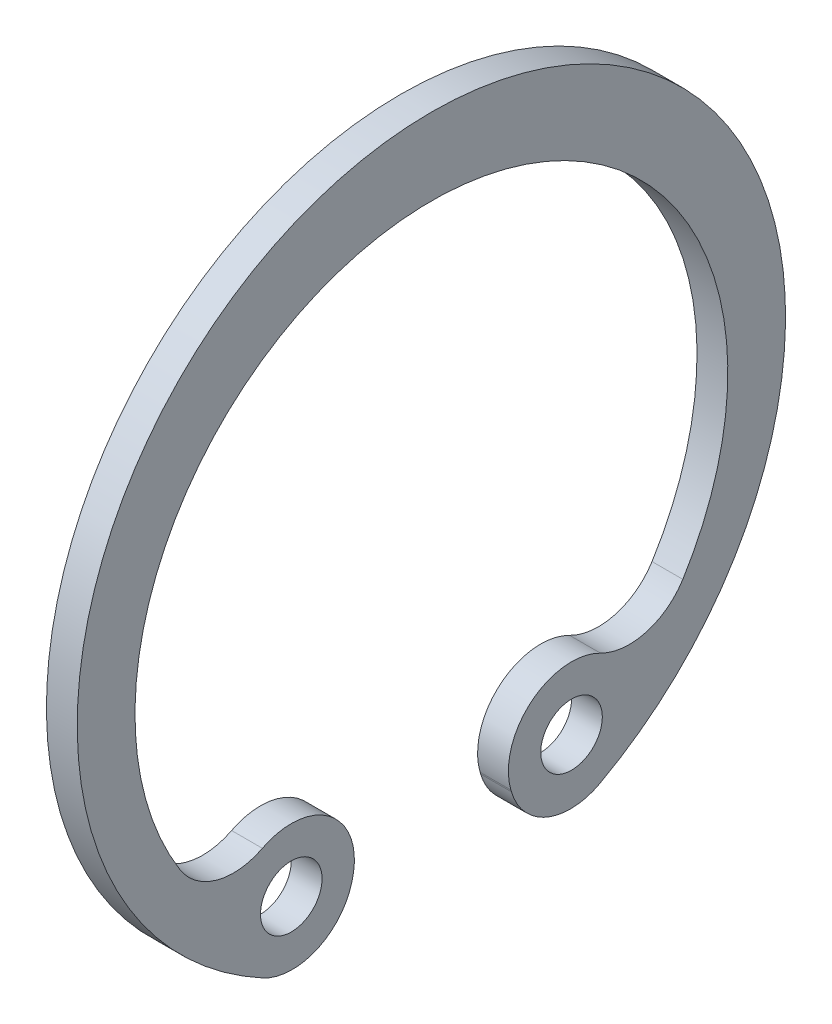
ISO-10303-21;
HEADER;
FILE_DESCRIPTION(('STEP AP214'),'2;1');
FILE_NAME('part.step','',(''),(''),'','','');
FILE_SCHEMA(('AUTOMOTIVE_DESIGN { 1 0 10303 214 1 1 1 1 }'));
ENDSEC;
DATA;
#1=APPLICATION_CONTEXT('core data for automotive mechanical design processes');
#2=APPLICATION_PROTOCOL_DEFINITION('international standard','automotive_design',2000,#1);
#3=PRODUCT_CONTEXT('',#1,'mechanical');
#4=PRODUCT('Part','Part','',(#3));
#5=PRODUCT_RELATED_PRODUCT_CATEGORY('part','',(#4));
#6=PRODUCT_DEFINITION_FORMATION('','',#4);
#7=PRODUCT_DEFINITION_CONTEXT('part definition',#1,'design');
#8=PRODUCT_DEFINITION('design','',#6,#7);
#9=PRODUCT_DEFINITION_SHAPE('','',#8);
#10=(LENGTH_UNIT() NAMED_UNIT(*) SI_UNIT(.MILLI.,.METRE.));
#11=(NAMED_UNIT(*) PLANE_ANGLE_UNIT() SI_UNIT($,.RADIAN.));
#12=(NAMED_UNIT(*) SI_UNIT($,.STERADIAN.) SOLID_ANGLE_UNIT());
#13=UNCERTAINTY_MEASURE_WITH_UNIT(LENGTH_MEASURE(1.E-05),#10,'distance_accuracy_value','');
#14=(GEOMETRIC_REPRESENTATION_CONTEXT(3) GLOBAL_UNCERTAINTY_ASSIGNED_CONTEXT((#13)) GLOBAL_UNIT_ASSIGNED_CONTEXT((#10,
#11,#12)) REPRESENTATION_CONTEXT('',''));
#15=CARTESIAN_POINT('',(0.,0.,0.));
#16=DIRECTION('',(0.,0.,1.));
#17=DIRECTION('',(1.,0.,0.));
#18=AXIS2_PLACEMENT_3D('',#15,#16,#17);
#19=CARTESIAN_POINT('',(0.5,-8.35614485396469,-4.51938526567201));
#20=DIRECTION('',(-1.,0.,0.));
#21=DIRECTION('',(0.,-0.879594195153662,-0.475724764808373));
#22=AXIS2_PLACEMENT_3D('',#19,#20,#21);
#23=CYLINDRICAL_SURFACE('',#22,1.99999999999884);
#24=CARTESIAN_POINT('',(-0.5,-8.35614485396469,-4.51938526567201));
#25=DIRECTION('',(1.,0.,0.));
#26=DIRECTION('',(0.,-0.279885186746017,0.960033479749611));
#27=AXIS2_PLACEMENT_3D('',#24,#25,#26);
#28=CIRCLE('',#27,1.99999999999884);
#29=CARTESIAN_POINT('',(-0.5,-8.9159152274564,-2.5993183061739));
#30=VERTEX_POINT('',#29);
#31=CARTESIAN_POINT('',(-0.5,-10.115333244271,-5.4708347952882));
#32=VERTEX_POINT('',#31);
#33=EDGE_CURVE('E95',#30,#32,#28,.T.);
#34=ORIENTED_EDGE('',*,*,#33,.T.);
#35=DIRECTION('',(1.,0.,0.));
#36=VECTOR('',#35,1.);
#37=CARTESIAN_POINT('',(-0.5,-10.115333244271,-5.4708347952882));
#38=LINE('',#37,#36);
#39=CARTESIAN_POINT('',(0.5,-10.115333244271,-5.4708347952882));
#40=VERTEX_POINT('',#39);
#41=EDGE_CURVE('E109',#40,#32,#38,.F.);
#42=ORIENTED_EDGE('',*,*,#41,.F.);
#43=CARTESIAN_POINT('',(0.5,-8.35614485396469,-4.51938526567201));
#44=DIRECTION('',(-1.,0.,0.));
#45=DIRECTION('',(0.,-0.879594195153662,-0.475724764808373));
#46=AXIS2_PLACEMENT_3D('',#43,#44,#45);
#47=CIRCLE('',#46,1.99999999999884);
#48=CARTESIAN_POINT('',(0.5,-8.9159152274564,-2.5993183061739));
#49=VERTEX_POINT('',#48);
#50=EDGE_CURVE('E115',#49,#40,#47,.F.);
#51=ORIENTED_EDGE('',*,*,#50,.F.);
#52=DIRECTION('',(-1.,0.,0.));
#53=VECTOR('',#52,1.);
#54=CARTESIAN_POINT('',(0.5,-8.9159152274564,-2.5993183061739));
#55=LINE('',#54,#53);
#56=EDGE_CURVE('E103',#49,#30,#55,.T.);
#57=ORIENTED_EDGE('',*,*,#56,.T.);
#58=EDGE_LOOP('',(#34,#42,#51,#57));
#59=FACE_BOUND('',#58,.T.);
#60=ADVANCED_FACE('F16',(#59),#23,.T.);
#61=CARTESIAN_POINT('',(0.5,2.27682456221956E-13,0.));
#62=DIRECTION('',(-1.,0.,0.));
#63=DIRECTION('',(0.,1.,0.));
#64=AXIS2_PLACEMENT_3D('',#61,#62,#63);
#65=CYLINDRICAL_SURFACE('',#64,11.4999999999998);
#66=ORIENTED_EDGE('',*,*,#41,.T.);
#67=CARTESIAN_POINT('',(-0.5,2.27682456221956E-13,0.));
#68=DIRECTION('',(1.,0.,0.));
#69=DIRECTION('',(0.,-0.879594195154038,-0.475724764807678));
#70=AXIS2_PLACEMENT_3D('',#67,#68,#69);
#71=CIRCLE('',#70,11.4999999999998);
#72=CARTESIAN_POINT('',(-0.5,-10.115333244271,5.4708347952882));
#73=VERTEX_POINT('',#72);
#74=EDGE_CURVE('E91',#32,#73,#71,.T.);
#75=ORIENTED_EDGE('',*,*,#74,.T.);
#76=DIRECTION('',(1.,0.,0.));
#77=VECTOR('',#76,1.);
#78=CARTESIAN_POINT('',(-0.5,-10.115333244271,5.4708347952882));
#79=LINE('',#78,#77);
#80=CARTESIAN_POINT('',(0.5,-10.115333244271,5.4708347952882));
#81=VERTEX_POINT('',#80);
#82=EDGE_CURVE('E102',#81,#73,#79,.F.);
#83=ORIENTED_EDGE('',*,*,#82,.F.);
#84=CARTESIAN_POINT('',(0.5,2.27682456221956E-13,0.));
#85=DIRECTION('',(-1.,0.,0.));
#86=DIRECTION('',(0.,-0.879594195154037,0.47572476480768));
#87=AXIS2_PLACEMENT_3D('',#84,#85,#86);
#88=CIRCLE('',#87,11.4999999999998);
#89=EDGE_CURVE('E114',#40,#81,#88,.F.);
#90=ORIENTED_EDGE('',*,*,#89,.F.);
#91=EDGE_LOOP('',(#66,#75,#83,#90));
#92=FACE_BOUND('',#91,.T.);
#93=ADVANCED_FACE('F113',(#92),#65,.T.);
#94=CARTESIAN_POINT('',(0.5,-8.3561448539647,4.51938526567201));
#95=DIRECTION('',(-1.,0.,0.));
#96=DIRECTION('',(0.,-0.279885186746011,-0.960033479749613));
#97=AXIS2_PLACEMENT_3D('',#94,#95,#96);
#98=CYLINDRICAL_SURFACE('',#97,1.99999999999884);
#99=CARTESIAN_POINT('',(-0.5,-8.3561448539647,4.51938526567201));
#100=DIRECTION('',(1.,0.,0.));
#101=DIRECTION('',(0.,-0.87959419515366,0.475724764808376));
#102=AXIS2_PLACEMENT_3D('',#99,#100,#101);
#103=CIRCLE('',#102,1.99999999999884);
#104=CARTESIAN_POINT('',(-0.5,-8.9159152274564,2.5993183061739));
#105=VERTEX_POINT('',#104);
#106=EDGE_CURVE('E97',#73,#105,#103,.T.);
#107=ORIENTED_EDGE('',*,*,#106,.T.);
#108=DIRECTION('',(1.,0.,0.));
#109=VECTOR('',#108,1.);
#110=CARTESIAN_POINT('',(-0.5,-8.9159152274564,2.5993183061739));
#111=LINE('',#110,#109);
#112=CARTESIAN_POINT('',(0.5,-8.9159152274564,2.5993183061739));
#113=VERTEX_POINT('',#112);
#114=EDGE_CURVE('E137',#113,#105,#111,.F.);
#115=ORIENTED_EDGE('',*,*,#114,.F.);
#116=CARTESIAN_POINT('',(0.5,-8.3561448539647,4.51938526567201));
#117=DIRECTION('',(-1.,0.,0.));
#118=DIRECTION('',(0.,-0.279885186746011,-0.960033479749613));
#119=AXIS2_PLACEMENT_3D('',#116,#117,#118);
#120=CIRCLE('',#119,1.99999999999884);
#121=EDGE_CURVE('E142',#81,#113,#120,.F.);
#122=ORIENTED_EDGE('',*,*,#121,.F.);
#123=ORIENTED_EDGE('',*,*,#82,.T.);
#124=EDGE_LOOP('',(#107,#115,#122,#123));
#125=FACE_BOUND('',#124,.T.);
#126=ADVANCED_FACE('F262',(#125),#98,.T.);
#127=CARTESIAN_POINT('',(-0.5,-8.8562763291698,2.5819313665136));
#128=DIRECTION('',(0.,-0.279885186746055,-0.9600334797496));
#129=DIRECTION('',(1.,0.,0.));
#130=AXIS2_PLACEMENT_3D('',#127,#128,#129);
#131=PLANE('',#130);
#132=DIRECTION('',(0.,0.9600334797496,-0.279885186746055));
#133=VECTOR('',#132,1.);
#134=CARTESIAN_POINT('',(-0.5,-8.9159152274564,2.5993183061739));
#135=LINE('',#134,#133);
#136=CARTESIAN_POINT('',(-0.5,-8.8562763291698,2.5819313665136));
#137=VERTEX_POINT('',#136);
#138=EDGE_CURVE('E146',#105,#137,#135,.T.);
#139=ORIENTED_EDGE('',*,*,#138,.T.);
#140=DIRECTION('',(1.,0.,0.));
#141=VECTOR('',#140,1.);
#142=CARTESIAN_POINT('',(-0.5,-8.8562763291698,2.5819313665136));
#143=LINE('',#142,#141);
#144=CARTESIAN_POINT('',(0.5,-8.8562763291698,2.5819313665136));
#145=VERTEX_POINT('',#144);
#146=EDGE_CURVE('E151',#145,#137,#143,.F.);
#147=ORIENTED_EDGE('',*,*,#146,.F.);
#148=DIRECTION('',(0.,-0.9600334797496,0.279885186746055));
#149=VECTOR('',#148,1.);
#150=CARTESIAN_POINT('',(0.5,-8.8562763291698,2.5819313665136));
#151=LINE('',#150,#149);
#152=EDGE_CURVE('E156',#113,#145,#151,.F.);
#153=ORIENTED_EDGE('',*,*,#152,.F.);
#154=ORIENTED_EDGE('',*,*,#114,.T.);
#155=EDGE_LOOP('',(#139,#147,#153,#154));
#156=FACE_BOUND('',#155,.T.);
#157=ADVANCED_FACE('F267',(#156),#131,.T.);
#158=CARTESIAN_POINT('',(0.5,-8.28251169633942,4.55));
#159=DIRECTION('',(-1.,0.,0.));
#160=DIRECTION('',(0.,0.889237660823935,0.457445496832548));
#161=AXIS2_PLACEMENT_3D('',#158,#159,#160);
#162=CYLINDRICAL_SURFACE('',#161,2.04999999999997);
#163=CARTESIAN_POINT('',(-0.5,-8.28251169633942,4.55));
#164=DIRECTION('',(1.,0.,0.));
#165=DIRECTION('',(0.,-0.279885186746527,-0.960033479749463));
#166=AXIS2_PLACEMENT_3D('',#163,#164,#165);
#167=CIRCLE('',#166,2.04999999999997);
#168=CARTESIAN_POINT('',(-0.5,-6.45957449165038,5.48776326850671));
#169=VERTEX_POINT('',#168);
#170=EDGE_CURVE('E160',#137,#169,#167,.T.);
#171=ORIENTED_EDGE('',*,*,#170,.T.);
#172=DIRECTION('',(1.,0.,0.));
#173=VECTOR('',#172,1.);
#174=CARTESIAN_POINT('',(-0.5,-6.45957449165038,5.48776326850671));
#175=LINE('',#174,#173);
#176=CARTESIAN_POINT('',(0.5,-6.45957449165038,5.48776326850671));
#177=VERTEX_POINT('',#176);
#178=EDGE_CURVE('E165',#177,#169,#175,.F.);
#179=ORIENTED_EDGE('',*,*,#178,.F.);
#180=CARTESIAN_POINT('',(0.5,-8.28251169633942,4.55));
#181=DIRECTION('',(-1.,0.,0.));
#182=DIRECTION('',(0.,0.889237660823935,0.457445496832547));
#183=AXIS2_PLACEMENT_3D('',#180,#181,#182);
#184=CIRCLE('',#183,2.04999999999997);
#185=EDGE_CURVE('E170',#145,#177,#184,.F.);
#186=ORIENTED_EDGE('',*,*,#185,.F.);
#187=ORIENTED_EDGE('',*,*,#146,.T.);
#188=EDGE_LOOP('',(#171,#179,#186,#187));
#189=FACE_BOUND('',#188,.T.);
#190=ADVANCED_FACE('F271',(#189),#162,.T.);
#191=CARTESIAN_POINT('',(0.5,-4.63663728696139,6.42552653701331));
#192=DIRECTION('',(-1.,0.,0.));
#193=DIRECTION('',(0.,-0.889237660823951,-0.457445496832516));
#194=AXIS2_PLACEMENT_3D('',#191,#192,#193);
#195=CYLINDRICAL_SURFACE('',#194,2.0499999999999);
#196=CARTESIAN_POINT('',(-0.5,-4.63663728696139,6.42552653701331));
#197=DIRECTION('',(-1.,0.,0.));
#198=DIRECTION('',(0.,-0.889237660823951,-0.457445496832516));
#199=AXIS2_PLACEMENT_3D('',#196,#197,#198);
#200=CIRCLE('',#199,2.0499999999999);
#201=CARTESIAN_POINT('',(-0.5,-5.7222949025745,8.1644479100664));
#202=VERTEX_POINT('',#201);
#203=EDGE_CURVE('E174',#202,#169,#200,.F.);
#204=ORIENTED_EDGE('',*,*,#203,.F.);
#205=DIRECTION('',(1.,0.,0.));
#206=VECTOR('',#205,1.);
#207=CARTESIAN_POINT('',(-0.5,-5.7222949025745,8.1644479100664));
#208=LINE('',#207,#206);
#209=CARTESIAN_POINT('',(0.5,-5.7222949025745,8.1644479100664));
#210=VERTEX_POINT('',#209);
#211=EDGE_CURVE('E178',#210,#202,#208,.F.);
#212=ORIENTED_EDGE('',*,*,#211,.F.);
#213=CARTESIAN_POINT('',(0.5,-4.63663728696139,6.42552653701331));
#214=DIRECTION('',(1.,0.,0.));
#215=DIRECTION('',(0.,-0.529589080786909,0.848254328318622));
#216=AXIS2_PLACEMENT_3D('',#213,#214,#215);
#217=CIRCLE('',#216,2.0499999999999);
#218=EDGE_CURVE('E183',#210,#177,#217,.T.);
#219=ORIENTED_EDGE('',*,*,#218,.T.);
#220=ORIENTED_EDGE('',*,*,#178,.T.);
#221=EDGE_LOOP('',(#204,#212,#219,#220));
#222=FACE_BOUND('',#221,.T.);
#223=ADVANCED_FACE('F275',(#222),#195,.F.);
#224=CARTESIAN_POINT('',(0.5,-0.624999999999986,0.));
#225=DIRECTION('',(-1.,0.,0.));
#226=DIRECTION('',(0.,-0.529589080786963,0.848254328318588));
#227=AXIS2_PLACEMENT_3D('',#224,#225,#226);
#228=CYLINDRICAL_SURFACE('',#227,9.625);
#229=ORIENTED_EDGE('',*,*,#211,.T.);
#230=CARTESIAN_POINT('',(-0.5,-0.624999999999986,0.));
#231=DIRECTION('',(-1.,0.,0.));
#232=DIRECTION('',(0.,-0.529589080786963,0.848254328318588));
#233=AXIS2_PLACEMENT_3D('',#230,#231,#232);
#234=CIRCLE('',#233,9.625);
#235=CARTESIAN_POINT('',(-0.5,-5.7222949025745,-8.16444791006641));
#236=VERTEX_POINT('',#235);
#237=EDGE_CURVE('E188',#236,#202,#234,.F.);
#238=ORIENTED_EDGE('',*,*,#237,.F.);
#239=DIRECTION('',(1.,0.,0.));
#240=VECTOR('',#239,1.);
#241=CARTESIAN_POINT('',(-0.5,-5.72229490257452,-8.16444791006641));
#242=LINE('',#241,#240);
#243=CARTESIAN_POINT('',(0.5,-5.72229490257451,-8.16444791006641));
#244=VERTEX_POINT('',#243);
#245=EDGE_CURVE('E192',#244,#236,#242,.F.);
#246=ORIENTED_EDGE('',*,*,#245,.F.);
#247=CARTESIAN_POINT('',(0.5,-0.624999999999986,0.));
#248=DIRECTION('',(1.,0.,0.));
#249=DIRECTION('',(0.,-0.529589080786963,-0.848254328318588));
#250=AXIS2_PLACEMENT_3D('',#247,#248,#249);
#251=CIRCLE('',#250,9.625);
#252=EDGE_CURVE('E197',#244,#210,#251,.T.);
#253=ORIENTED_EDGE('',*,*,#252,.T.);
#254=EDGE_LOOP('',(#229,#238,#246,#253));
#255=FACE_BOUND('',#254,.T.);
#256=ADVANCED_FACE('F279',(#255),#228,.F.);
#257=CARTESIAN_POINT('',(0.5,-4.63663728696139,-6.42552653701331));
#258=DIRECTION('',(-1.,0.,0.));
#259=DIRECTION('',(0.,-0.529589080786909,-0.848254328318622));
#260=AXIS2_PLACEMENT_3D('',#257,#258,#259);
#261=CYLINDRICAL_SURFACE('',#260,2.0499999999999);
#262=CARTESIAN_POINT('',(-0.5,-4.63663728696139,-6.42552653701331));
#263=DIRECTION('',(-1.,0.,0.));
#264=DIRECTION('',(0.,-0.529589080786912,-0.84825432831862));
#265=AXIS2_PLACEMENT_3D('',#262,#263,#264);
#266=CIRCLE('',#265,2.0499999999999);
#267=CARTESIAN_POINT('',(-0.5,-6.4595744916504,-5.4877632685067));
#268=VERTEX_POINT('',#267);
#269=EDGE_CURVE('E202',#268,#236,#266,.F.);
#270=ORIENTED_EDGE('',*,*,#269,.F.);
#271=DIRECTION('',(1.,0.,0.));
#272=VECTOR('',#271,1.);
#273=CARTESIAN_POINT('',(-0.5,-6.4595744916504,-5.4877632685067));
#274=LINE('',#273,#272);
#275=CARTESIAN_POINT('',(0.5,-6.4595744916504,-5.4877632685067));
#276=VERTEX_POINT('',#275);
#277=EDGE_CURVE('E206',#276,#268,#274,.F.);
#278=ORIENTED_EDGE('',*,*,#277,.F.);
#279=CARTESIAN_POINT('',(0.5,-4.63663728696139,-6.42552653701331));
#280=DIRECTION('',(1.,0.,0.));
#281=DIRECTION('',(0.,-0.889237660823951,0.457445496832516));
#282=AXIS2_PLACEMENT_3D('',#279,#280,#281);
#283=CIRCLE('',#282,2.0499999999999);
#284=EDGE_CURVE('E211',#276,#244,#283,.T.);
#285=ORIENTED_EDGE('',*,*,#284,.T.);
#286=ORIENTED_EDGE('',*,*,#245,.T.);
#287=EDGE_LOOP('',(#270,#278,#285,#286));
#288=FACE_BOUND('',#287,.T.);
#289=ADVANCED_FACE('F283',(#288),#261,.F.);
#290=CARTESIAN_POINT('',(0.5,-8.28251169633942,-4.55));
#291=DIRECTION('',(-1.,0.,0.));
#292=DIRECTION('',(0.,-0.279885186746527,0.960033479749463));
#293=AXIS2_PLACEMENT_3D('',#290,#291,#292);
#294=CYLINDRICAL_SURFACE('',#293,2.04999999999997);
#295=CARTESIAN_POINT('',(-0.5,-8.28251169633942,-4.55));
#296=DIRECTION('',(1.,0.,0.));
#297=DIRECTION('',(0.,0.889237660823935,-0.457445496832549));
#298=AXIS2_PLACEMENT_3D('',#295,#296,#297);
#299=CIRCLE('',#298,2.04999999999997);
#300=CARTESIAN_POINT('',(-0.5,-8.85627632916979,-2.58193136651363));
#301=VERTEX_POINT('',#300);
#302=EDGE_CURVE('E216',#268,#301,#299,.T.);
#303=ORIENTED_EDGE('',*,*,#302,.T.);
#304=DIRECTION('',(1.,0.,0.));
#305=VECTOR('',#304,1.);
#306=CARTESIAN_POINT('',(-0.5,-8.85627632916979,-2.58193136651363));
#307=LINE('',#306,#305);
#308=CARTESIAN_POINT('',(0.5,-8.85627632916979,-2.58193136651363));
#309=VERTEX_POINT('',#308);
#310=EDGE_CURVE('E220',#309,#301,#307,.F.);
#311=ORIENTED_EDGE('',*,*,#310,.F.);
#312=CARTESIAN_POINT('',(0.5,-8.28251169633942,-4.55));
#313=DIRECTION('',(-1.,0.,0.));
#314=DIRECTION('',(0.,-0.279885186746527,0.960033479749463));
#315=AXIS2_PLACEMENT_3D('',#312,#313,#314);
#316=CIRCLE('',#315,2.04999999999997);
#317=EDGE_CURVE('E31',#276,#309,#316,.F.);
#318=ORIENTED_EDGE('',*,*,#317,.F.);
#319=ORIENTED_EDGE('',*,*,#277,.T.);
#320=EDGE_LOOP('',(#303,#311,#318,#319));
#321=FACE_BOUND('',#320,.T.);
#322=ADVANCED_FACE('F287',(#321),#294,.T.);
#323=CARTESIAN_POINT('',(-0.5,-8.9159152274564,-2.5993183061739));
#324=DIRECTION('',(0.,-0.279885186746055,0.9600334797496));
#325=DIRECTION('',(1.,0.,0.));
#326=AXIS2_PLACEMENT_3D('',#323,#324,#325);
#327=PLANE('',#326);
#328=DIRECTION('',(0.,-0.9600334797496,-0.279885186746055));
#329=VECTOR('',#328,1.);
#330=CARTESIAN_POINT('',(-0.5,-8.8562763291698,-2.5819313665136));
#331=LINE('',#330,#329);
#332=EDGE_CURVE('E39',#301,#30,#331,.T.);
#333=ORIENTED_EDGE('',*,*,#332,.T.);
#334=ORIENTED_EDGE('',*,*,#56,.F.);
#335=DIRECTION('',(0.,0.9600334797496,0.279885186746055));
#336=VECTOR('',#335,1.);
#337=CARTESIAN_POINT('',(0.5,-8.9159152274564,-2.5993183061739));
#338=LINE('',#337,#336);
#339=EDGE_CURVE('E231',#309,#49,#338,.F.);
#340=ORIENTED_EDGE('',*,*,#339,.F.);
#341=ORIENTED_EDGE('',*,*,#310,.T.);
#342=EDGE_LOOP('',(#333,#334,#340,#341));
#343=FACE_BOUND('',#342,.T.);
#344=ADVANCED_FACE('F291',(#343),#327,.T.);
#345=CARTESIAN_POINT('',(0.5,-10.3671807774286,11.7712311631676));
#346=DIRECTION('',(1.,0.,0.));
#347=DIRECTION('',(0.,0.,-1.));
#348=AXIS2_PLACEMENT_3D('',#345,#346,#347);
#349=PLANE('',#348);
#350=ORIENTED_EDGE('',*,*,#50,.T.);
#351=ORIENTED_EDGE('',*,*,#89,.T.);
#352=ORIENTED_EDGE('',*,*,#121,.T.);
#353=ORIENTED_EDGE('',*,*,#152,.T.);
#354=ORIENTED_EDGE('',*,*,#185,.T.);
#355=ORIENTED_EDGE('',*,*,#218,.F.);
#356=ORIENTED_EDGE('',*,*,#252,.F.);
#357=ORIENTED_EDGE('',*,*,#284,.F.);
#358=ORIENTED_EDGE('',*,*,#317,.T.);
#359=ORIENTED_EDGE('',*,*,#339,.T.);
#360=EDGE_LOOP('',(#350,#351,#352,#353,#354,#355,#356,#357,#358,#359));
#361=FACE_BOUND('',#360,.T.);
#362=CARTESIAN_POINT('',(0.5,-8.2825116963395,-4.55));
#363=DIRECTION('',(-1.,0.,0.));
#364=DIRECTION('',(0.,0.,-1.));
#365=AXIS2_PLACEMENT_3D('',#362,#363,#364);
#366=CIRCLE('',#365,1.);
#367=CARTESIAN_POINT('',(0.5,-8.2825116963395,-5.55));
#368=VERTEX_POINT('',#367);
#369=EDGE_CURVE('E235',#368,#368,#366,.F.);
#370=ORIENTED_EDGE('',*,*,#369,.F.);
#371=EDGE_LOOP('',(#370));
#372=FACE_BOUND('',#371,.T.);
#373=CARTESIAN_POINT('',(0.5,-8.2825116963395,4.55));
#374=DIRECTION('',(-1.,0.,0.));
#375=DIRECTION('',(0.,1.42051179707896E-07,-0.99999999999999));
#376=AXIS2_PLACEMENT_3D('',#373,#374,#375);
#377=CIRCLE('',#376,1.);
#378=CARTESIAN_POINT('',(0.5,-8.28251155428832,3.55000000000001));
#379=VERTEX_POINT('',#378);
#380=EDGE_CURVE('E240',#379,#379,#377,.F.);
#381=ORIENTED_EDGE('',*,*,#380,.F.);
#382=EDGE_LOOP('',(#381));
#383=FACE_BOUND('',#382,.T.);
#384=ADVANCED_FACE('F255',(#361,#372,#383),#349,.T.);
#385=CARTESIAN_POINT('',(-0.5,-10.3671807774286,11.7712311631676));
#386=DIRECTION('',(-1.,0.,0.));
#387=DIRECTION('',(0.,1.,0.));
#388=AXIS2_PLACEMENT_3D('',#385,#386,#387);
#389=PLANE('',#388);
#390=ORIENTED_EDGE('',*,*,#74,.F.);
#391=ORIENTED_EDGE('',*,*,#33,.F.);
#392=ORIENTED_EDGE('',*,*,#332,.F.);
#393=ORIENTED_EDGE('',*,*,#302,.F.);
#394=ORIENTED_EDGE('',*,*,#269,.T.);
#395=ORIENTED_EDGE('',*,*,#237,.T.);
#396=ORIENTED_EDGE('',*,*,#203,.T.);
#397=ORIENTED_EDGE('',*,*,#170,.F.);
#398=ORIENTED_EDGE('',*,*,#138,.F.);
#399=ORIENTED_EDGE('',*,*,#106,.F.);
#400=EDGE_LOOP('',(#390,#391,#392,#393,#394,#395,#396,#397,#398,#399));
#401=FACE_BOUND('',#400,.T.);
#402=CARTESIAN_POINT('',(-0.5,-8.2825116963395,-4.55));
#403=DIRECTION('',(1.,0.,0.));
#404=DIRECTION('',(0.,-1.42053957929992E-07,0.99999999999999));
#405=AXIS2_PLACEMENT_3D('',#402,#403,#404);
#406=CIRCLE('',#405,1.);
#407=CARTESIAN_POINT('',(-0.5,-8.28251183839346,-3.55000000000001));
#408=VERTEX_POINT('',#407);
#409=EDGE_CURVE('E24',#408,#408,#406,.T.);
#410=ORIENTED_EDGE('',*,*,#409,.T.);
#411=EDGE_LOOP('',(#410));
#412=FACE_BOUND('',#411,.T.);
#413=CARTESIAN_POINT('',(-0.5,-8.2825116963395,4.55));
#414=DIRECTION('',(1.,0.,0.));
#415=DIRECTION('',(0.,-1.42053847795868E-07,0.99999999999999));
#416=AXIS2_PLACEMENT_3D('',#413,#414,#415);
#417=CIRCLE('',#416,1.);
#418=CARTESIAN_POINT('',(-0.5,-8.28251183839335,5.54999999999999));
#419=VERTEX_POINT('',#418);
#420=EDGE_CURVE('E10',#419,#419,#417,.T.);
#421=ORIENTED_EDGE('',*,*,#420,.T.);
#422=EDGE_LOOP('',(#421));
#423=FACE_BOUND('',#422,.T.);
#424=ADVANCED_FACE('F93',(#401,#412,#423),#389,.T.);
#425=CARTESIAN_POINT('',(0.5,-8.2825116963395,-4.55));
#426=DIRECTION('',(-1.,0.,0.));
#427=DIRECTION('',(0.,0.,-1.));
#428=AXIS2_PLACEMENT_3D('',#425,#426,#427);
#429=CYLINDRICAL_SURFACE('',#428,1.);
#430=ORIENTED_EDGE('',*,*,#369,.T.);
#431=EDGE_LOOP('',(#430));
#432=FACE_BOUND('',#431,.T.);
#433=ORIENTED_EDGE('',*,*,#409,.F.);
#434=EDGE_LOOP('',(#433));
#435=FACE_BOUND('',#434,.T.);
#436=ADVANCED_FACE('F246',(#432,#435),#429,.F.);
#437=CARTESIAN_POINT('',(0.5,-8.2825116963395,4.55));
#438=DIRECTION('',(-1.,0.,0.));
#439=DIRECTION('',(0.,1.42051179830356E-07,-0.99999999999999));
#440=AXIS2_PLACEMENT_3D('',#437,#438,#439);
#441=CYLINDRICAL_SURFACE('',#440,1.);
#442=ORIENTED_EDGE('',*,*,#380,.T.);
#443=EDGE_LOOP('',(#442));
#444=FACE_BOUND('',#443,.T.);
#445=ORIENTED_EDGE('',*,*,#420,.F.);
#446=EDGE_LOOP('',(#445));
#447=FACE_BOUND('',#446,.T.);
#448=ADVANCED_FACE('F18',(#444,#447),#441,.F.);
#449=CLOSED_SHELL('',(#60,#93,#126,#157,#190,#223,#256,#289,#322,#344,#384,#424,#436,#448));
#450=MANIFOLD_SOLID_BREP('B1',#449);
#451=ADVANCED_BREP_SHAPE_REPRESENTATION('',(#18,#450),#14);
#452=SHAPE_DEFINITION_REPRESENTATION(#9,#451);
ENDSEC;
END-ISO-10303-21;
